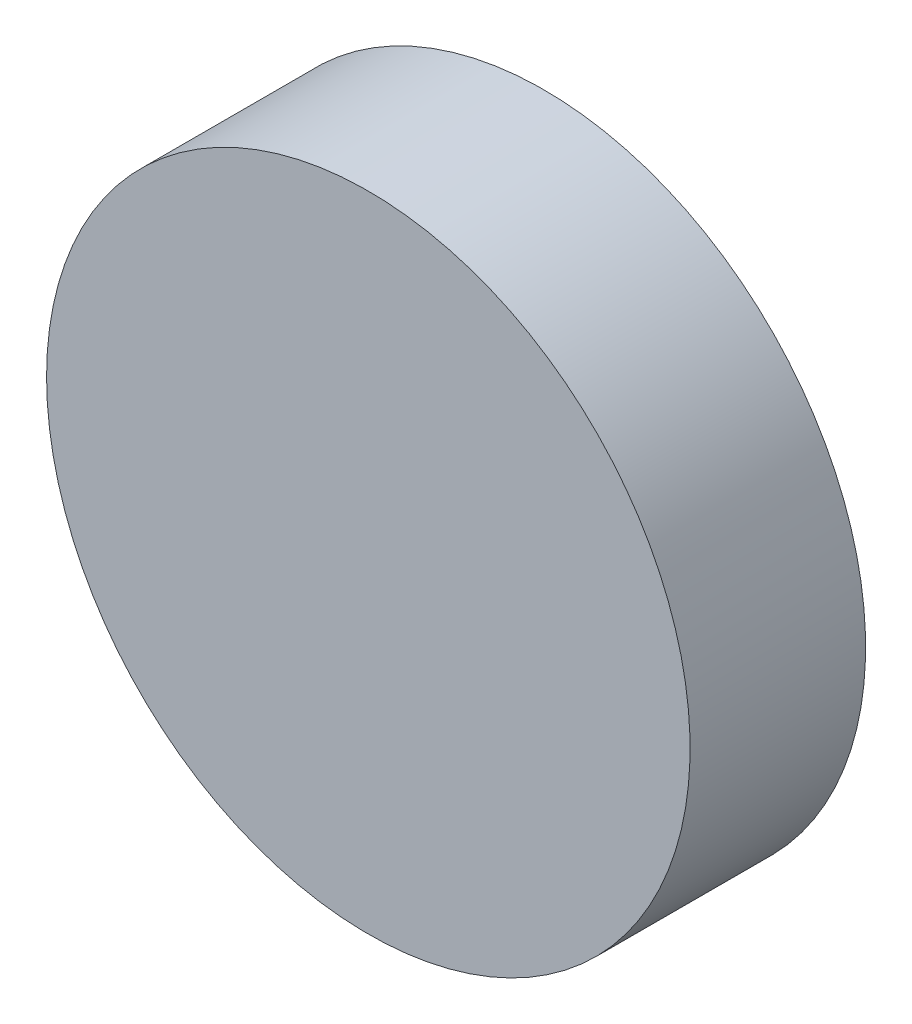
ISO-10303-21;
HEADER;
FILE_DESCRIPTION(('STEP AP214'),'2;1');
FILE_NAME('part.step','',(''),(''),'','','');
FILE_SCHEMA(('AUTOMOTIVE_DESIGN { 1 0 10303 214 1 1 1 1 }'));
ENDSEC;
DATA;
#1=APPLICATION_CONTEXT('core data for automotive mechanical design processes');
#2=APPLICATION_PROTOCOL_DEFINITION('international standard','automotive_design',2000,#1);
#3=PRODUCT_CONTEXT('',#1,'mechanical');
#4=PRODUCT('Part','Part','',(#3));
#5=PRODUCT_RELATED_PRODUCT_CATEGORY('part','',(#4));
#6=PRODUCT_DEFINITION_FORMATION('','',#4);
#7=PRODUCT_DEFINITION_CONTEXT('part definition',#1,'design');
#8=PRODUCT_DEFINITION('design','',#6,#7);
#9=PRODUCT_DEFINITION_SHAPE('','',#8);
#10=(LENGTH_UNIT() NAMED_UNIT(*) SI_UNIT(.MILLI.,.METRE.));
#11=(NAMED_UNIT(*) PLANE_ANGLE_UNIT() SI_UNIT($,.RADIAN.));
#12=(NAMED_UNIT(*) SI_UNIT($,.STERADIAN.) SOLID_ANGLE_UNIT());
#13=UNCERTAINTY_MEASURE_WITH_UNIT(LENGTH_MEASURE(1.E-05),#10,'distance_accuracy_value','');
#14=(GEOMETRIC_REPRESENTATION_CONTEXT(3) GLOBAL_UNCERTAINTY_ASSIGNED_CONTEXT((#13)) GLOBAL_UNIT_ASSIGNED_CONTEXT((#10,
#11,#12)) REPRESENTATION_CONTEXT('',''));
#15=CARTESIAN_POINT('',(0.,0.,0.));
#16=DIRECTION('',(0.,0.,1.));
#17=DIRECTION('',(1.,0.,0.));
#18=AXIS2_PLACEMENT_3D('',#15,#16,#17);
#19=CARTESIAN_POINT('',(0.,0.,4.7625));
#20=DIRECTION('',(0.,0.,-1.));
#21=DIRECTION('',(-1.,0.,0.));
#22=AXIS2_PLACEMENT_3D('',#19,#20,#21);
#23=CYLINDRICAL_SURFACE('',#22,8.73125);
#24=CARTESIAN_POINT('',(0.,0.,4.7625));
#25=DIRECTION('',(0.,0.,1.));
#26=DIRECTION('',(1.,0.,0.));
#27=AXIS2_PLACEMENT_3D('',#24,#25,#26);
#28=CIRCLE('',#27,8.73125);
#29=CARTESIAN_POINT('',(-8.73125,0.,4.7625));
#30=VERTEX_POINT('',#29);
#31=EDGE_CURVE('E10',#30,#30,#28,.T.);
#32=CARTESIAN_POINT('',(0.,0.,0.));
#33=DIRECTION('',(0.,0.,1.));
#34=DIRECTION('',(1.,0.,0.));
#35=AXIS2_PLACEMENT_3D('',#32,#33,#34);
#36=CIRCLE('',#35,8.73125);
#37=CARTESIAN_POINT('',(-8.73125,0.,0.));
#38=VERTEX_POINT('',#37);
#39=EDGE_CURVE('E35',#38,#38,#36,.T.);
#40=CARTESIAN_POINT('',(-8.73125,0.,4.7625));
#41=CARTESIAN_POINT('',(-8.73125,0.,4.712890625));
#42=CARTESIAN_POINT('',(-8.73125,0.,4.66328125));
#43=CARTESIAN_POINT('',(-8.73125,0.,4.5640625));
#44=CARTESIAN_POINT('',(-8.73125,0.,4.514453125));
#45=CARTESIAN_POINT('',(-8.73125,0.,4.415234375));
#46=CARTESIAN_POINT('',(-8.73125,0.,4.365625));
#47=CARTESIAN_POINT('',(-8.73125,0.,4.26640625));
#48=CARTESIAN_POINT('',(-8.73125,0.,4.216796875));
#49=CARTESIAN_POINT('',(-8.73125,0.,4.117578125));
#50=CARTESIAN_POINT('',(-8.73125,0.,4.06796875));
#51=CARTESIAN_POINT('',(-8.73125,0.,3.96875));
#52=CARTESIAN_POINT('',(-8.73125,0.,3.919140625));
#53=CARTESIAN_POINT('',(-8.73125,0.,3.819921875));
#54=CARTESIAN_POINT('',(-8.73125,0.,3.7703125));
#55=CARTESIAN_POINT('',(-8.73125,0.,3.67109375));
#56=CARTESIAN_POINT('',(-8.73125,0.,3.621484375));
#57=CARTESIAN_POINT('',(-8.73125,0.,3.522265625));
#58=CARTESIAN_POINT('',(-8.73125,0.,3.47265625));
#59=CARTESIAN_POINT('',(-8.73125,0.,3.3734375));
#60=CARTESIAN_POINT('',(-8.73125,0.,3.323828125));
#61=CARTESIAN_POINT('',(-8.73125,0.,3.224609375));
#62=CARTESIAN_POINT('',(-8.73125,0.,3.175));
#63=CARTESIAN_POINT('',(-8.73125,0.,3.07578125));
#64=CARTESIAN_POINT('',(-8.73125,0.,3.026171875));
#65=CARTESIAN_POINT('',(-8.73125,0.,2.926953125));
#66=CARTESIAN_POINT('',(-8.73125,0.,2.87734375));
#67=CARTESIAN_POINT('',(-8.73125,0.,2.778125));
#68=CARTESIAN_POINT('',(-8.73125,0.,2.728515625));
#69=CARTESIAN_POINT('',(-8.73125,0.,2.629296875));
#70=CARTESIAN_POINT('',(-8.73125,0.,2.5796875));
#71=CARTESIAN_POINT('',(-8.73125,0.,2.48046875));
#72=CARTESIAN_POINT('',(-8.73125,0.,2.430859375));
#73=CARTESIAN_POINT('',(-8.73125,0.,2.331640625));
#74=CARTESIAN_POINT('',(-8.73125,0.,2.28203125));
#75=CARTESIAN_POINT('',(-8.73125,0.,2.1828125));
#76=CARTESIAN_POINT('',(-8.73125,0.,2.133203125));
#77=CARTESIAN_POINT('',(-8.73125,0.,2.033984375));
#78=CARTESIAN_POINT('',(-8.73125,0.,1.984375));
#79=CARTESIAN_POINT('',(-8.73125,0.,1.88515625));
#80=CARTESIAN_POINT('',(-8.73125,0.,1.835546875));
#81=CARTESIAN_POINT('',(-8.73125,0.,1.736328125));
#82=CARTESIAN_POINT('',(-8.73125,0.,1.68671875));
#83=CARTESIAN_POINT('',(-8.73125,0.,1.5875));
#84=CARTESIAN_POINT('',(-8.73125,0.,1.537890625));
#85=CARTESIAN_POINT('',(-8.73125,0.,1.438671875));
#86=CARTESIAN_POINT('',(-8.73125,0.,1.3890625));
#87=CARTESIAN_POINT('',(-8.73125,0.,1.28984375));
#88=CARTESIAN_POINT('',(-8.73125,0.,1.240234375));
#89=CARTESIAN_POINT('',(-8.73125,0.,1.141015625));
#90=CARTESIAN_POINT('',(-8.73125,0.,1.09140625));
#91=CARTESIAN_POINT('',(-8.73125,0.,0.992187499999999));
#92=CARTESIAN_POINT('',(-8.73125,0.,0.942578124999999));
#93=CARTESIAN_POINT('',(-8.73125,0.,0.843359375));
#94=CARTESIAN_POINT('',(-8.73125,0.,0.79375));
#95=CARTESIAN_POINT('',(-8.73125,0.,0.69453125));
#96=CARTESIAN_POINT('',(-8.73125,0.,0.644921875));
#97=CARTESIAN_POINT('',(-8.73125,0.,0.545703125));
#98=CARTESIAN_POINT('',(-8.73125,0.,0.49609375));
#99=CARTESIAN_POINT('',(-8.73125,0.,0.396875));
#100=CARTESIAN_POINT('',(-8.73125,0.,0.347265625));
#101=CARTESIAN_POINT('',(-8.73125,0.,0.248046875));
#102=CARTESIAN_POINT('',(-8.73125,0.,0.1984375));
#103=CARTESIAN_POINT('',(-8.73125,0.,0.09921875));
#104=CARTESIAN_POINT('',(-8.73125,0.,0.049609375));
#105=CARTESIAN_POINT('',(-8.73125,0.,0.));
#106=B_SPLINE_CURVE_WITH_KNOTS('',3,(#40,#41,#42,#43,#44,#45,#46,#47,#48,#49,#50,#51,#52,#53,
#54,#55,#56,#57,#58,#59,#60,#61,#62,#63,#64,#65,#66,#67,#68,#69,#70,#71,#72,#73,#74,#75,#76,#77,
#78,#79,#80,#81,#82,#83,#84,#85,#86,#87,#88,#89,#90,#91,#92,#93,#94,#95,#96,#97,#98,#99,#100,
#101,#102,#103,#104,#105),.UNSPECIFIED.,.F.,.F.,(4,2,2,2,2,2,2,2,2,2,2,2,2,2,2,2,2,2,2,2,2,2,2,
2,2,2,2,2,2,2,2,2,4),(0.,0.148828125,0.29765625,0.446484375,0.5953125,0.744140625,
0.892968750000001,1.041796875,1.190625,1.339453125,1.48828125,1.637109375,1.7859375,1.934765625,
2.08359375,2.232421875,2.38125,2.530078125,2.67890625,2.827734375,2.9765625,3.125390625,
3.27421875,3.423046875,3.571875,3.720703125,3.86953125,4.018359375,4.1671875,4.316015625,
4.46484375,4.613671875,4.7625),.UNSPECIFIED.);
#107=EDGE_CURVE('BSEAM32',#30,#38,#106,.T.);
#108=ORIENTED_EDGE('',*,*,#31,.F.);
#109=ORIENTED_EDGE('',*,*,#39,.T.);
#110=ORIENTED_EDGE('',*,*,#107,.T.);
#111=ORIENTED_EDGE('',*,*,#107,.F.);
#112=EDGE_LOOP('',(#108,#110,#109,#111));
#113=FACE_BOUND('',#112,.T.);
#114=ADVANCED_FACE('F32',(#113),#23,.T.);
#115=CARTESIAN_POINT('',(0.,0.,4.7625));
#116=DIRECTION('',(0.,0.,1.));
#117=DIRECTION('',(1.,0.,0.));
#118=AXIS2_PLACEMENT_3D('',#115,#116,#117);
#119=PLANE('',#118);
#120=ORIENTED_EDGE('',*,*,#31,.T.);
#121=EDGE_LOOP('',(#120));
#122=FACE_BOUND('',#121,.T.);
#123=ADVANCED_FACE('F47',(#122),#119,.T.);
#124=CARTESIAN_POINT('',(0.,0.,0.));
#125=DIRECTION('',(0.,0.,1.));
#126=DIRECTION('',(1.,0.,0.));
#127=AXIS2_PLACEMENT_3D('',#124,#125,#126);
#128=PLANE('',#127);
#129=ORIENTED_EDGE('',*,*,#39,.F.);
#130=EDGE_LOOP('',(#129));
#131=FACE_BOUND('',#130,.T.);
#132=ADVANCED_FACE('F45',(#131),#128,.F.);
#133=CLOSED_SHELL('',(#114,#123,#132));
#134=MANIFOLD_SOLID_BREP('B2',#133);
#135=ADVANCED_BREP_SHAPE_REPRESENTATION('',(#18,#134),#14);
#136=SHAPE_DEFINITION_REPRESENTATION(#9,#135);
ENDSEC;
END-ISO-10303-21;
